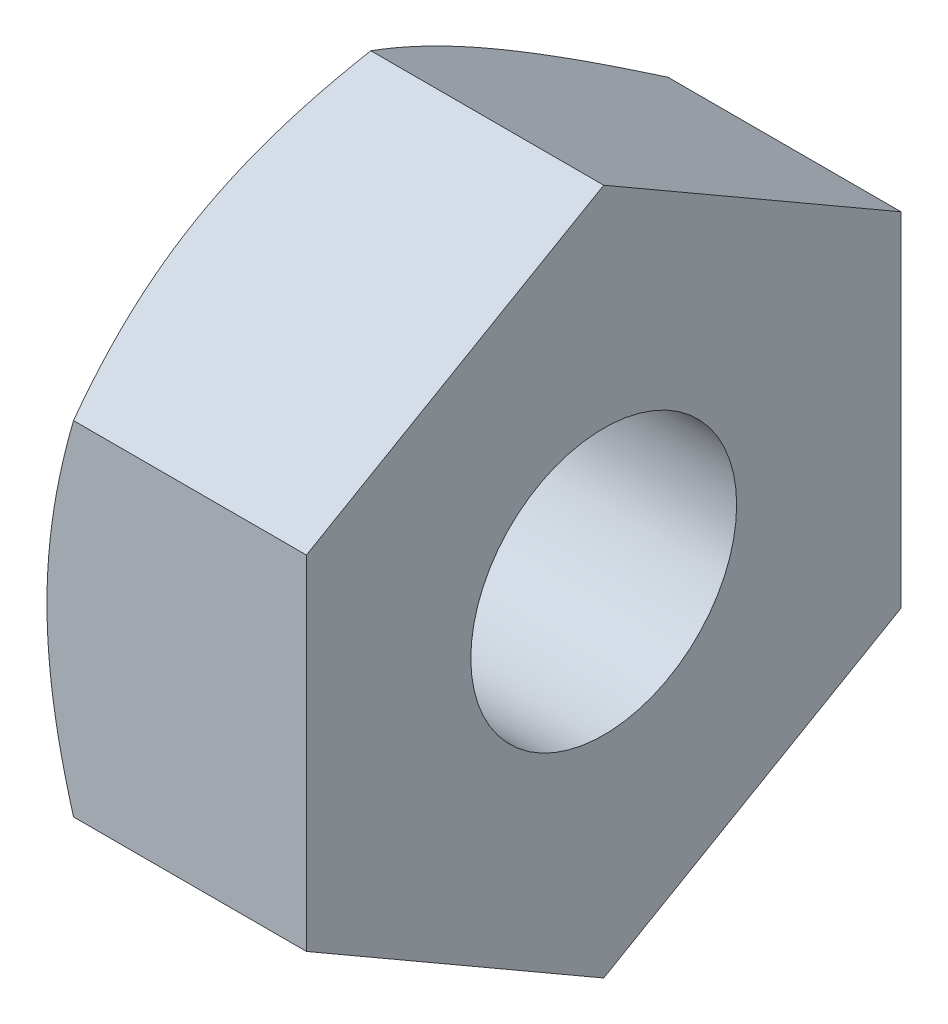
ISO-10303-21;
HEADER;
FILE_DESCRIPTION(('STEP AP214'),'2;1');
FILE_NAME('part.step','',(''),(''),'','','');
FILE_SCHEMA(('AUTOMOTIVE_DESIGN { 1 0 10303 214 1 1 1 1 }'));
ENDSEC;
DATA;
#1=APPLICATION_CONTEXT('core data for automotive mechanical design processes');
#2=APPLICATION_PROTOCOL_DEFINITION('international standard','automotive_design',2000,#1);
#3=PRODUCT_CONTEXT('',#1,'mechanical');
#4=PRODUCT('Part','Part','',(#3));
#5=PRODUCT_RELATED_PRODUCT_CATEGORY('part','',(#4));
#6=PRODUCT_DEFINITION_FORMATION('','',#4);
#7=PRODUCT_DEFINITION_CONTEXT('part definition',#1,'design');
#8=PRODUCT_DEFINITION('design','',#6,#7);
#9=PRODUCT_DEFINITION_SHAPE('','',#8);
#10=(LENGTH_UNIT() NAMED_UNIT(*) SI_UNIT(.MILLI.,.METRE.));
#11=(NAMED_UNIT(*) PLANE_ANGLE_UNIT() SI_UNIT($,.RADIAN.));
#12=(NAMED_UNIT(*) SI_UNIT($,.STERADIAN.) SOLID_ANGLE_UNIT());
#13=UNCERTAINTY_MEASURE_WITH_UNIT(LENGTH_MEASURE(1.E-05),#10,'distance_accuracy_value','');
#14=(GEOMETRIC_REPRESENTATION_CONTEXT(3) GLOBAL_UNCERTAINTY_ASSIGNED_CONTEXT((#13)) GLOBAL_UNIT_ASSIGNED_CONTEXT((#10,
#11,#12)) REPRESENTATION_CONTEXT('',''));
#15=CARTESIAN_POINT('',(0.,0.,0.));
#16=DIRECTION('',(0.,0.,1.));
#17=DIRECTION('',(1.,0.,0.));
#18=AXIS2_PLACEMENT_3D('',#15,#16,#17);
#19=CARTESIAN_POINT('',(-2.4,1.58771324027147,-2.75));
#20=DIRECTION('',(0.,0.866025403784439,-0.5));
#21=DIRECTION('',(0.,0.5,0.866025403784439));
#22=AXIS2_PLACEMENT_3D('',#19,#20,#21);
#23=PLANE('',#22);
#24=DIRECTION('',(1.,0.,0.));
#25=VECTOR('',#24,1.);
#26=CARTESIAN_POINT('',(-2.4,1.58771324027147,-2.75));
#27=LINE('',#26,#25);
#28=CARTESIAN_POINT('',(-2.15437990693814,1.58771324027146,-2.75));
#29=VERTEX_POINT('',#28);
#30=CARTESIAN_POINT('',(0.,1.58771324027147,-2.75));
#31=VERTEX_POINT('',#30);
#32=EDGE_CURVE('E139',#29,#31,#27,.T.);
#33=ORIENTED_EDGE('',*,*,#32,.F.);
#34=CARTESIAN_POINT('',(-2.15431323663524,1.58759777021763,-2.7502));
#35=CARTESIAN_POINT('',(-2.19461233775074,1.65737010029698,-2.62935077934009));
#36=CARTESIAN_POINT('',(-2.23126309740234,1.72774469983533,-2.50745839737737));
#37=CARTESIAN_POINT('',(-2.2952378170302,1.86971254687002,-2.26156287327211));
#38=CARTESIAN_POINT('',(-2.32253914432551,1.94130831721582,-2.13755536142615));
#39=CARTESIAN_POINT('',(-2.36503825470589,2.08361254889598,-1.89107720202406));
#40=CARTESIAN_POINT('',(-2.38051888137754,2.15429911309863,-1.76864448141258));
#41=CARTESIAN_POINT('',(-2.39900060263006,2.29600490065922,-1.52320285763109));
#42=CARTESIAN_POINT('',(-2.4020170005374,2.36702360884403,-1.40019484676709));
#43=CARTESIAN_POINT('',(-2.39574685457146,2.49972966594896,-1.17034121338921));
#44=CARTESIAN_POINT('',(-2.3879998457233,2.56143686540072,-1.06346120874598));
#45=CARTESIAN_POINT('',(-2.36344481893565,2.68444923614046,-0.850397532665252));
#46=CARTESIAN_POINT('',(-2.34662841034943,2.74575398185007,-0.744214598351112));
#47=CARTESIAN_POINT('',(-2.30458807765405,2.86902004703206,-0.530711510606818));
#48=CARTESIAN_POINT('',(-2.27918591931277,2.93096576264318,-0.423418383857146));
#49=CARTESIAN_POINT('',(-2.22153277416002,3.05393320806133,-0.21043252071595));
#50=CARTESIAN_POINT('',(-2.18929533670102,3.11495651365995,-0.104737054973348));
#51=CARTESIAN_POINT('',(-2.15431323663525,3.17554195059677,0.000199999999999626));
#52=B_SPLINE_CURVE_WITH_KNOTS('',3,(#34,#35,#36,#37,#38,#39,#40,#41,#42,#43,#44,#45,#46,#47,#48,
#49,#50,#51),.UNSPECIFIED.,.F.,.F.,(4,2,2,2,2,2,2,2,4),(0.,0.435912828725887,0.87287355711633,
1.29901931904671,1.72464171213573,2.09526089052937,2.46622354066374,2.84541551798557,
3.22386274754524),.UNSPECIFIED.);
#53=CARTESIAN_POINT('',(-2.4,2.38156986040721,-1.375));
#54=VERTEX_POINT('',#53);
#55=EDGE_CURVE('E120',#29,#54,#52,.T.);
#56=ORIENTED_EDGE('',*,*,#55,.T.);
#57=CARTESIAN_POINT('',(-2.15437990693814,3.17542648054294,0.));
#58=VERTEX_POINT('',#57);
#59=EDGE_CURVE('E52',#54,#58,#52,.T.);
#60=ORIENTED_EDGE('',*,*,#59,.T.);
#61=DIRECTION('',(1.,0.,0.));
#62=VECTOR('',#61,1.);
#63=CARTESIAN_POINT('',(-2.4,3.17542648054294,0.));
#64=LINE('',#63,#62);
#65=CARTESIAN_POINT('',(0.,3.17542648054294,0.));
#66=VERTEX_POINT('',#65);
#67=EDGE_CURVE('E118',#58,#66,#64,.T.);
#68=ORIENTED_EDGE('',*,*,#67,.T.);
#69=DIRECTION('',(0.,0.5,0.866025403784439));
#70=VECTOR('',#69,1.);
#71=CARTESIAN_POINT('',(0.,1.58771324027147,-2.75));
#72=LINE('',#71,#70);
#73=EDGE_CURVE('E150',#31,#66,#72,.T.);
#74=ORIENTED_EDGE('',*,*,#73,.F.);
#75=EDGE_LOOP('',(#33,#56,#60,#68,#74));
#76=FACE_BOUND('',#75,.T.);
#77=ADVANCED_FACE('F36',(#76),#23,.T.);
#78=CARTESIAN_POINT('',(-2.4,-1.58771324027148,-2.75));
#79=DIRECTION('',(0.,0.,-1.));
#80=DIRECTION('',(-1.,0.,0.));
#81=AXIS2_PLACEMENT_3D('',#78,#79,#80);
#82=PLANE('',#81);
#83=DIRECTION('',(1.,0.,0.));
#84=VECTOR('',#83,1.);
#85=CARTESIAN_POINT('',(-2.4,-1.58771324027148,-2.75));
#86=LINE('',#85,#84);
#87=CARTESIAN_POINT('',(-2.15437990693814,-1.58771324027149,-2.74999999999998));
#88=VERTEX_POINT('',#87);
#89=CARTESIAN_POINT('',(0.,-1.58771324027148,-2.75));
#90=VERTEX_POINT('',#89);
#91=EDGE_CURVE('E137',#88,#90,#86,.T.);
#92=ORIENTED_EDGE('',*,*,#91,.F.);
#93=CARTESIAN_POINT('',(-1.08405156039708,-4.21084949309676,-2.75));
#94=CARTESIAN_POINT('',(-1.14240006384777,-4.0901089421409,-2.75));
#95=CARTESIAN_POINT('',(-1.20016853488243,-3.9690829206551,-2.75));
#96=CARTESIAN_POINT('',(-1.31421396157696,-3.72630558284844,-2.75));
#97=CARTESIAN_POINT('',(-1.37049065899754,-3.60455414536201,-2.75));
#98=CARTESIAN_POINT('',(-1.48151755664725,-3.35951393034355,-2.75));
#99=CARTESIAN_POINT('',(-1.53625717839417,-3.23622034236437,-2.75));
#100=CARTESIAN_POINT('',(-1.64338522252356,-2.98861980138744,-2.75));
#101=CARTESIAN_POINT('',(-1.69577376746325,-2.86431290161182,-2.75));
#102=CARTESIAN_POINT('',(-1.79819642785388,-2.61294485887172,-2.75));
#103=CARTESIAN_POINT('',(-1.84819374210161,-2.48586863815655,-2.75));
#104=CARTESIAN_POINT('',(-1.9442725912154,-2.23021732171541,-2.75));
#105=CARTESIAN_POINT('',(-1.99035369042303,-2.10164206103364,-2.75));
#106=CARTESIAN_POINT('',(-2.07736192295377,-1.84305218799468,-2.75));
#107=CARTESIAN_POINT('',(-2.11830001358611,-1.71304130052584,-2.75));
#108=CARTESIAN_POINT('',(-2.19369269237565,-1.45117125062148,-2.75));
#109=CARTESIAN_POINT('',(-2.22814933084723,-1.31931268690203,-2.75));
#110=CARTESIAN_POINT('',(-2.2889063284691,-1.05365722480013,-2.75));
#111=CARTESIAN_POINT('',(-2.31520451590488,-0.919859820217597,-2.75));
#112=CARTESIAN_POINT('',(-2.35787396280339,-0.650651874037387,-2.75));
#113=CARTESIAN_POINT('',(-2.37424521348946,-0.515241331013601,-2.75));
#114=CARTESIAN_POINT('',(-2.39561250345976,-0.244373242869217,-2.75));
#115=CARTESIAN_POINT('',(-2.40068055677322,-0.108921526377139,-2.75));
#116=CARTESIAN_POINT('',(-2.39917220436733,0.161887058855127,-2.75));
#117=CARTESIAN_POINT('',(-2.39259882131445,0.297243943089634,-2.75));
#118=CARTESIAN_POINT('',(-2.37189586995316,0.528385436717537,-2.75));
#119=CARTESIAN_POINT('',(-2.36046235896981,0.624425050137497,-2.75));
#120=CARTESIAN_POINT('',(-2.33247828038665,0.815762399811543,-2.75));
#121=CARTESIAN_POINT('',(-2.31592690577232,0.911060016631967,-2.75));
#122=CARTESIAN_POINT('',(-2.25946463872172,1.19576218748917,-2.75));
#123=CARTESIAN_POINT('',(-2.21276014058271,1.38383224738498,-2.75));
#124=CARTESIAN_POINT('',(-2.13220750296942,1.66525048947487,-2.75));
#125=CARTESIAN_POINT('',(-2.1031966650045,1.76006556248559,-2.75));
#126=CARTESIAN_POINT('',(-2.04230435109341,1.94870609382217,-2.75));
#127=CARTESIAN_POINT('',(-2.0104248551215,2.04253218553698,-2.75));
#128=CARTESIAN_POINT('',(-1.94445858181355,2.22880240354987,-2.75));
#129=CARTESIAN_POINT('',(-1.91038523854447,2.32125133588454,-2.75));
#130=CARTESIAN_POINT('',(-1.84023863176889,2.50543192042631,-2.75));
#131=CARTESIAN_POINT('',(-1.80416455996268,2.59716326539582,-2.75));
#132=CARTESIAN_POINT('',(-1.76728755800251,2.68856293053349,-2.75));
#133=B_SPLINE_CURVE_WITH_KNOTS('',3,(#93,#94,#95,#96,#97,#98,#99,#100,#101,#102,#103,#104,#105,
#106,#107,#108,#109,#110,#111,#112,#113,#114,#115,#116,#117,#118,#119,#120,#121,#122,#123,#124,
#125,#126,#127,#128,#129,#130,#131,#132),.UNSPECIFIED.,.F.,.F.,(4,2,2,2,2,2,2,2,2,2,2,2,2,2,2,2,
2,2,2,4),(0.,0.402305607365936,0.804680408536997,1.20935783819118,1.61401414820818,
2.0236383818577,2.43330812457348,2.842089694796,3.25074173456636,3.65950246109143,
4.06826354901183,4.47441284024649,4.88045669141171,5.17046846817546,5.46052599902452,
6.04107275309884,6.33851131304663,6.63574613017457,6.93130791005795,7.22698998004825),.UNSPECIFIED.);
#134=CARTESIAN_POINT('',(-2.4,0.,-2.75));
#135=VERTEX_POINT('',#134);
#136=EDGE_CURVE('E241',#88,#135,#133,.T.);
#137=ORIENTED_EDGE('',*,*,#136,.T.);
#138=EDGE_CURVE('E163',#135,#29,#133,.T.);
#139=ORIENTED_EDGE('',*,*,#138,.T.);
#140=ORIENTED_EDGE('',*,*,#32,.T.);
#141=DIRECTION('',(0.,1.,0.));
#142=VECTOR('',#141,1.);
#143=CARTESIAN_POINT('',(0.,-1.58771324027148,-2.75));
#144=LINE('',#143,#142);
#145=EDGE_CURVE('E127',#90,#31,#144,.T.);
#146=ORIENTED_EDGE('',*,*,#145,.F.);
#147=EDGE_LOOP('',(#92,#137,#139,#140,#146));
#148=FACE_BOUND('',#147,.T.);
#149=ADVANCED_FACE('F227',(#148),#82,.T.);
#150=CARTESIAN_POINT('',(-2.4,-3.17542648054295,0.));
#151=DIRECTION('',(0.,-0.866025403784439,-0.5));
#152=DIRECTION('',(0.,0.5,-0.866025403784439));
#153=AXIS2_PLACEMENT_3D('',#150,#151,#152);
#154=PLANE('',#153);
#155=DIRECTION('',(1.,0.,0.));
#156=VECTOR('',#155,1.);
#157=CARTESIAN_POINT('',(-2.4,-3.17542648054295,0.));
#158=LINE('',#157,#156);
#159=CARTESIAN_POINT('',(-2.15437990693814,-3.17542648054294,0.));
#160=VERTEX_POINT('',#159);
#161=CARTESIAN_POINT('',(0.,-3.17542648054295,0.));
#162=VERTEX_POINT('',#161);
#163=EDGE_CURVE('E135',#160,#162,#158,.T.);
#164=ORIENTED_EDGE('',*,*,#163,.F.);
#165=CARTESIAN_POINT('',(-2.15431323663524,-3.17554195059679,0.000199999999999914));
#166=CARTESIAN_POINT('',(-2.19461233775074,-3.10576962051743,-0.120649220659906));
#167=CARTESIAN_POINT('',(-2.23126309740234,-3.03539502097909,-0.242541602622635));
#168=CARTESIAN_POINT('',(-2.2952378170302,-2.89342717394439,-0.488437126727894));
#169=CARTESIAN_POINT('',(-2.3225391443255,-2.82183140359859,-0.612444638573857));
#170=CARTESIAN_POINT('',(-2.36503825470588,-2.67952717191843,-0.858922797975945));
#171=CARTESIAN_POINT('',(-2.38051888137754,-2.60884060771578,-0.981355518587419));
#172=CARTESIAN_POINT('',(-2.39900060263006,-2.46713482015519,-1.22679714236892));
#173=CARTESIAN_POINT('',(-2.4020170005374,-2.39611611197038,-1.34980515323291));
#174=CARTESIAN_POINT('',(-2.39574685457145,-2.26341005486545,-1.5796587866108));
#175=CARTESIAN_POINT('',(-2.38799984572329,-2.20170285541369,-1.68653879125402));
#176=CARTESIAN_POINT('',(-2.36344481893564,-2.07869048467395,-1.89960246733475));
#177=CARTESIAN_POINT('',(-2.34662841034943,-2.01738573896434,-2.00578540164889));
#178=CARTESIAN_POINT('',(-2.30458807765404,-1.89411967378236,-2.21928848939318));
#179=CARTESIAN_POINT('',(-2.27918591931277,-1.83217395817124,-2.32658161614286));
#180=CARTESIAN_POINT('',(-2.22153277416002,-1.70920651275308,-2.53956747928405));
#181=CARTESIAN_POINT('',(-2.18929533670102,-1.64818320715447,-2.64526294502665));
#182=CARTESIAN_POINT('',(-2.15431323663524,-1.58759777021764,-2.7502));
#183=B_SPLINE_CURVE_WITH_KNOTS('',3,(#165,#166,#167,#168,#169,#170,#171,#172,#173,#174,#175,
#176,#177,#178,#179,#180,#181,#182),.UNSPECIFIED.,.F.,.F.,(4,2,2,2,2,2,2,2,4),(0.,
0.435912828725889,0.872873557116333,1.29901931904672,1.72464171213574,2.09526089052938,
2.46622354066374,2.84541551798557,3.22386274754524),.UNSPECIFIED.);
#184=CARTESIAN_POINT('',(-2.4,-2.38156986040721,-1.375));
#185=VERTEX_POINT('',#184);
#186=EDGE_CURVE('E152',#160,#185,#183,.T.);
#187=ORIENTED_EDGE('',*,*,#186,.T.);
#188=EDGE_CURVE('E153',#185,#88,#183,.T.);
#189=ORIENTED_EDGE('',*,*,#188,.T.);
#190=ORIENTED_EDGE('',*,*,#91,.T.);
#191=DIRECTION('',(0.,0.5,-0.866025403784439));
#192=VECTOR('',#191,1.);
#193=CARTESIAN_POINT('',(0.,-3.17542648054295,0.));
#194=LINE('',#193,#192);
#195=EDGE_CURVE('E131',#162,#90,#194,.T.);
#196=ORIENTED_EDGE('',*,*,#195,.F.);
#197=EDGE_LOOP('',(#164,#187,#189,#190,#196));
#198=FACE_BOUND('',#197,.T.);
#199=ADVANCED_FACE('F170',(#198),#154,.T.);
#200=CARTESIAN_POINT('',(-2.4,-1.58771324027148,2.75));
#201=DIRECTION('',(0.,-0.866025403784439,0.5));
#202=DIRECTION('',(0.,-0.5,-0.866025403784439));
#203=AXIS2_PLACEMENT_3D('',#200,#201,#202);
#204=PLANE('',#203);
#205=DIRECTION('',(1.,0.,0.));
#206=VECTOR('',#205,1.);
#207=CARTESIAN_POINT('',(-2.4,-1.58771324027148,2.75));
#208=LINE('',#207,#206);
#209=CARTESIAN_POINT('',(-2.15437990693814,-1.58771324027146,2.75));
#210=VERTEX_POINT('',#209);
#211=CARTESIAN_POINT('',(0.,-1.58771324027148,2.75));
#212=VERTEX_POINT('',#211);
#213=EDGE_CURVE('E128',#210,#212,#208,.T.);
#214=ORIENTED_EDGE('',*,*,#213,.F.);
#215=CARTESIAN_POINT('',(-2.15431323663524,-1.58759777021764,2.7502));
#216=CARTESIAN_POINT('',(-2.19461233775074,-1.65737010029699,2.62935077934009));
#217=CARTESIAN_POINT('',(-2.23126309740234,-1.72774469983534,2.50745839737737));
#218=CARTESIAN_POINT('',(-2.2952378170302,-1.86971254687003,2.26156287327211));
#219=CARTESIAN_POINT('',(-2.3225391443255,-1.94130831721584,2.13755536142614));
#220=CARTESIAN_POINT('',(-2.36503825470588,-2.083612548896,1.89107720202406));
#221=CARTESIAN_POINT('',(-2.38051888137754,-2.15429911309865,1.76864448141258));
#222=CARTESIAN_POINT('',(-2.39900060263006,-2.29600490065924,1.52320285763108));
#223=CARTESIAN_POINT('',(-2.4020170005374,-2.36702360884404,1.40019484676709));
#224=CARTESIAN_POINT('',(-2.39574685457145,-2.49972966594898,1.17034121338921));
#225=CARTESIAN_POINT('',(-2.38799984572329,-2.56143686540073,1.06346120874598));
#226=CARTESIAN_POINT('',(-2.36344481893564,-2.68444923614047,0.85039753266525));
#227=CARTESIAN_POINT('',(-2.34662841034943,-2.74575398185009,0.744214598351111));
#228=CARTESIAN_POINT('',(-2.30458807765404,-2.86902004703207,0.530711510606816));
#229=CARTESIAN_POINT('',(-2.27918591931277,-2.93096576264319,0.423418383857145));
#230=CARTESIAN_POINT('',(-2.22153277416002,-3.05393320806134,0.210432520715949));
#231=CARTESIAN_POINT('',(-2.18929533670102,-3.11495651365996,0.104737054973347));
#232=CARTESIAN_POINT('',(-2.15431323663524,-3.17554195059679,-0.000199999999999977));
#233=B_SPLINE_CURVE_WITH_KNOTS('',3,(#215,#216,#217,#218,#219,#220,#221,#222,#223,#224,#225,
#226,#227,#228,#229,#230,#231,#232),.UNSPECIFIED.,.F.,.F.,(4,2,2,2,2,2,2,2,4),(0.,
0.435912828725889,0.872873557116332,1.29901931904672,1.72464171213574,2.09526089052937,
2.46622354066374,2.84541551798557,3.22386274754524),.UNSPECIFIED.);
#234=CARTESIAN_POINT('',(-2.4,-2.38156986040721,1.375));
#235=VERTEX_POINT('',#234);
#236=EDGE_CURVE('E203',#210,#235,#233,.T.);
#237=ORIENTED_EDGE('',*,*,#236,.T.);
#238=EDGE_CURVE('E162',#235,#160,#233,.T.);
#239=ORIENTED_EDGE('',*,*,#238,.T.);
#240=ORIENTED_EDGE('',*,*,#163,.T.);
#241=DIRECTION('',(0.,-0.5,-0.866025403784438));
#242=VECTOR('',#241,1.);
#243=CARTESIAN_POINT('',(0.,-1.58771324027148,2.75));
#244=LINE('',#243,#242);
#245=EDGE_CURVE('E143',#212,#162,#244,.T.);
#246=ORIENTED_EDGE('',*,*,#245,.F.);
#247=EDGE_LOOP('',(#214,#237,#239,#240,#246));
#248=FACE_BOUND('',#247,.T.);
#249=ADVANCED_FACE('F210',(#248),#204,.T.);
#250=CARTESIAN_POINT('',(-2.4,1.58771324027147,2.75));
#251=DIRECTION('',(0.,0.,1.));
#252=DIRECTION('',(1.,0.,0.));
#253=AXIS2_PLACEMENT_3D('',#250,#251,#252);
#254=PLANE('',#253);
#255=DIRECTION('',(1.,0.,0.));
#256=VECTOR('',#255,1.);
#257=CARTESIAN_POINT('',(-2.4,1.58771324027147,2.75));
#258=LINE('',#257,#256);
#259=CARTESIAN_POINT('',(-2.15437990693814,1.58771324027147,2.75));
#260=VERTEX_POINT('',#259);
#261=CARTESIAN_POINT('',(0.,1.58771324027147,2.75));
#262=VERTEX_POINT('',#261);
#263=EDGE_CURVE('E126',#260,#262,#258,.T.);
#264=ORIENTED_EDGE('',*,*,#263,.F.);
#265=CARTESIAN_POINT('',(-1.08405156039708,-4.21084949309676,2.75));
#266=CARTESIAN_POINT('',(-1.14240006384777,-4.0901089421409,2.75));
#267=CARTESIAN_POINT('',(-1.20016853488243,-3.9690829206551,2.75));
#268=CARTESIAN_POINT('',(-1.31421396157696,-3.72630558284844,2.75));
#269=CARTESIAN_POINT('',(-1.37049065899754,-3.60455414536201,2.75));
#270=CARTESIAN_POINT('',(-1.48151755664725,-3.35951393034355,2.75));
#271=CARTESIAN_POINT('',(-1.53625717839417,-3.23622034236437,2.75));
#272=CARTESIAN_POINT('',(-1.64338522252356,-2.98861980138744,2.75));
#273=CARTESIAN_POINT('',(-1.69577376746325,-2.86431290161182,2.75));
#274=CARTESIAN_POINT('',(-1.79819642785388,-2.61294485887172,2.75));
#275=CARTESIAN_POINT('',(-1.84819374210161,-2.48586863815655,2.75));
#276=CARTESIAN_POINT('',(-1.9442725912154,-2.23021732171541,2.75));
#277=CARTESIAN_POINT('',(-1.99035369042303,-2.10164206103364,2.75));
#278=CARTESIAN_POINT('',(-2.07736192295377,-1.84305218799468,2.75));
#279=CARTESIAN_POINT('',(-2.11830001358611,-1.71304130052584,2.75));
#280=CARTESIAN_POINT('',(-2.19369269237565,-1.45117125062148,2.75));
#281=CARTESIAN_POINT('',(-2.22814933084723,-1.31931268690203,2.75));
#282=CARTESIAN_POINT('',(-2.2889063284691,-1.05365722480013,2.75));
#283=CARTESIAN_POINT('',(-2.31520451590488,-0.919859820217596,2.75));
#284=CARTESIAN_POINT('',(-2.35787396280339,-0.650651874037386,2.75));
#285=CARTESIAN_POINT('',(-2.37424521348946,-0.5152413310136,2.75));
#286=CARTESIAN_POINT('',(-2.39561250345976,-0.244373242869216,2.75));
#287=CARTESIAN_POINT('',(-2.40068055677322,-0.108921526377138,2.75));
#288=CARTESIAN_POINT('',(-2.39917220436733,0.161887058855129,2.75));
#289=CARTESIAN_POINT('',(-2.39259882131445,0.297243943089635,2.75));
#290=CARTESIAN_POINT('',(-2.37189586995316,0.528385436717538,2.75));
#291=CARTESIAN_POINT('',(-2.36046235896981,0.624425050137498,2.75));
#292=CARTESIAN_POINT('',(-2.33247828038665,0.815762399811544,2.75));
#293=CARTESIAN_POINT('',(-2.31592690577232,0.911060016631968,2.75));
#294=CARTESIAN_POINT('',(-2.25946463872172,1.19576218748917,2.75));
#295=CARTESIAN_POINT('',(-2.21276014058271,1.38383224738498,2.75));
#296=CARTESIAN_POINT('',(-2.13220750296942,1.66525048947487,2.75));
#297=CARTESIAN_POINT('',(-2.1031966650045,1.7600655624856,2.75));
#298=CARTESIAN_POINT('',(-2.04230435109341,1.94870609382217,2.75));
#299=CARTESIAN_POINT('',(-2.01042485512149,2.04253218553698,2.75));
#300=CARTESIAN_POINT('',(-1.94445858181355,2.22880240354987,2.75));
#301=CARTESIAN_POINT('',(-1.91038523854446,2.32125133588454,2.75));
#302=CARTESIAN_POINT('',(-1.84023863176889,2.50543192042631,2.75));
#303=CARTESIAN_POINT('',(-1.80416455996268,2.59716326539582,2.75));
#304=CARTESIAN_POINT('',(-1.76728755800251,2.68856293053349,2.75));
#305=B_SPLINE_CURVE_WITH_KNOTS('',3,(#265,#266,#267,#268,#269,#270,#271,#272,#273,#274,#275,
#276,#277,#278,#279,#280,#281,#282,#283,#284,#285,#286,#287,#288,#289,#290,#291,#292,#293,#294,
#295,#296,#297,#298,#299,#300,#301,#302,#303,#304),.UNSPECIFIED.,.F.,.F.,(4,2,2,2,2,2,2,2,2,2,2,
2,2,2,2,2,2,2,2,4),(0.,0.402305607365936,0.804680408536996,1.20935783819118,1.61401414820818,
2.0236383818577,2.43330812457348,2.842089694796,3.25074173456636,3.65950246109143,
4.06826354901183,4.47441284024649,4.88045669141171,5.17046846817546,5.46052599902452,
6.04107275309884,6.33851131304663,6.63574613017457,6.93130791005795,7.22698998004826),.UNSPECIFIED.);
#306=CARTESIAN_POINT('',(-2.4,0.,2.75));
#307=VERTEX_POINT('',#306);
#308=EDGE_CURVE('E112',#260,#307,#305,.F.);
#309=ORIENTED_EDGE('',*,*,#308,.T.);
#310=EDGE_CURVE('E209',#307,#210,#305,.F.);
#311=ORIENTED_EDGE('',*,*,#310,.T.);
#312=ORIENTED_EDGE('',*,*,#213,.T.);
#313=DIRECTION('',(0.,-1.,0.));
#314=VECTOR('',#313,1.);
#315=CARTESIAN_POINT('',(0.,1.58771324027147,2.75));
#316=LINE('',#315,#314);
#317=EDGE_CURVE('E146',#262,#212,#316,.T.);
#318=ORIENTED_EDGE('',*,*,#317,.F.);
#319=EDGE_LOOP('',(#264,#309,#311,#312,#318));
#320=FACE_BOUND('',#319,.T.);
#321=ADVANCED_FACE('F213',(#320),#254,.T.);
#322=CARTESIAN_POINT('',(-2.4,3.17542648054294,0.));
#323=DIRECTION('',(0.,0.866025403784439,0.5));
#324=DIRECTION('',(0.,-0.5,0.866025403784439));
#325=AXIS2_PLACEMENT_3D('',#322,#323,#324);
#326=PLANE('',#325);
#327=ORIENTED_EDGE('',*,*,#67,.F.);
#328=CARTESIAN_POINT('',(-2.15431323663525,3.17554195059677,-0.000200000000000679));
#329=CARTESIAN_POINT('',(-2.19461233775074,3.10576962051742,0.120649220659905));
#330=CARTESIAN_POINT('',(-2.23126309740234,3.03539502097907,0.242541602622633));
#331=CARTESIAN_POINT('',(-2.2952378170302,2.89342717394438,0.488437126727891));
#332=CARTESIAN_POINT('',(-2.32253914432551,2.82183140359858,0.612444638573853));
#333=CARTESIAN_POINT('',(-2.36503825470589,2.67952717191842,0.858922797975941));
#334=CARTESIAN_POINT('',(-2.38051888137755,2.60884060771577,0.981355518587414));
#335=CARTESIAN_POINT('',(-2.39900060263006,2.46713482015518,1.22679714236891));
#336=CARTESIAN_POINT('',(-2.4020170005374,2.39611611197037,1.34980515323291));
#337=CARTESIAN_POINT('',(-2.39574685457146,2.26341005486544,1.57965878661079));
#338=CARTESIAN_POINT('',(-2.3879998457233,2.20170285541368,1.68653879125402));
#339=CARTESIAN_POINT('',(-2.36344481893565,2.07869048467394,1.89960246733475));
#340=CARTESIAN_POINT('',(-2.34662841034943,2.01738573896433,2.00578540164889));
#341=CARTESIAN_POINT('',(-2.30458807765405,1.89411967378234,2.21928848939318));
#342=CARTESIAN_POINT('',(-2.27918591931277,1.83217395817122,2.32658161614285));
#343=CARTESIAN_POINT('',(-2.22153277416002,1.70920651275307,2.53956747928405));
#344=CARTESIAN_POINT('',(-2.18929533670102,1.64818320715446,2.64526294502665));
#345=CARTESIAN_POINT('',(-2.15431323663524,1.58759777021763,2.7502));
#346=B_SPLINE_CURVE_WITH_KNOTS('',3,(#328,#329,#330,#331,#332,#333,#334,#335,#336,#337,#338,
#339,#340,#341,#342,#343,#344,#345),.UNSPECIFIED.,.F.,.F.,(4,2,2,2,2,2,2,2,4),(0.,
0.435912828725887,0.872873557116329,1.29901931904671,1.72464171213573,2.09526089052937,
2.46622354066374,2.84541551798557,3.22386274754524),.UNSPECIFIED.);
#347=CARTESIAN_POINT('',(-2.4,2.38156986040721,1.375));
#348=VERTEX_POINT('',#347);
#349=EDGE_CURVE('E106',#58,#348,#346,.T.);
#350=ORIENTED_EDGE('',*,*,#349,.T.);
#351=EDGE_CURVE('E59',#348,#260,#346,.T.);
#352=ORIENTED_EDGE('',*,*,#351,.T.);
#353=ORIENTED_EDGE('',*,*,#263,.T.);
#354=DIRECTION('',(0.,-0.5,0.866025403784439));
#355=VECTOR('',#354,1.);
#356=CARTESIAN_POINT('',(0.,3.17542648054294,0.));
#357=LINE('',#356,#355);
#358=EDGE_CURVE('E124',#66,#262,#357,.T.);
#359=ORIENTED_EDGE('',*,*,#358,.F.);
#360=EDGE_LOOP('',(#327,#350,#352,#353,#359));
#361=FACE_BOUND('',#360,.T.);
#362=ADVANCED_FACE('F122',(#361),#326,.T.);
#363=CARTESIAN_POINT('',(0.,0.,0.));
#364=DIRECTION('',(1.,0.,0.));
#365=DIRECTION('',(0.,0.,-1.));
#366=AXIS2_PLACEMENT_3D('',#363,#364,#365);
#367=PLANE('',#366);
#368=CARTESIAN_POINT('',(0.,0.,0.));
#369=DIRECTION('',(-1.,0.,0.));
#370=DIRECTION('',(0.,0.,1.));
#371=AXIS2_PLACEMENT_3D('',#368,#369,#370);
#372=CIRCLE('',#371,1.2295);
#373=CARTESIAN_POINT('',(0.,0.,1.2295));
#374=VERTEX_POINT('',#373);
#375=EDGE_CURVE('E268',#374,#374,#372,.T.);
#376=ORIENTED_EDGE('',*,*,#375,.T.);
#377=EDGE_LOOP('',(#376));
#378=FACE_BOUND('',#377,.T.);
#379=ORIENTED_EDGE('',*,*,#73,.T.);
#380=ORIENTED_EDGE('',*,*,#358,.T.);
#381=ORIENTED_EDGE('',*,*,#317,.T.);
#382=ORIENTED_EDGE('',*,*,#245,.T.);
#383=ORIENTED_EDGE('',*,*,#195,.T.);
#384=ORIENTED_EDGE('',*,*,#145,.T.);
#385=EDGE_LOOP('',(#379,#380,#381,#382,#383,#384));
#386=FACE_BOUND('',#385,.T.);
#387=ADVANCED_FACE('F220',(#378,#386),#367,.T.);
#388=CARTESIAN_POINT('',(-2.4,0.,0.));
#389=DIRECTION('',(1.,0.,0.));
#390=DIRECTION('',(0.,0.,-1.));
#391=AXIS2_PLACEMENT_3D('',#388,#389,#390);
#392=CONICAL_SURFACE('',#391,2.75,1.0471975511966);
#393=CARTESIAN_POINT('',(-2.4,0.,0.));
#394=DIRECTION('',(1.,0.,0.));
#395=DIRECTION('',(0.,0.,-1.));
#396=AXIS2_PLACEMENT_3D('',#393,#394,#395);
#397=CIRCLE('',#396,2.75);
#398=EDGE_CURVE('E40',#185,#135,#397,.T.);
#399=ORIENTED_EDGE('',*,*,#398,.T.);
#400=ORIENTED_EDGE('',*,*,#136,.F.);
#401=ORIENTED_EDGE('',*,*,#188,.F.);
#402=EDGE_LOOP('',(#399,#400,#401));
#403=FACE_BOUND('',#402,.T.);
#404=ADVANCED_FACE('F224',(#403),#392,.T.);
#405=ORIENTED_EDGE('',*,*,#238,.F.);
#406=EDGE_CURVE('E254',#235,#185,#397,.T.);
#407=ORIENTED_EDGE('',*,*,#406,.T.);
#408=ORIENTED_EDGE('',*,*,#186,.F.);
#409=EDGE_LOOP('',(#405,#407,#408));
#410=FACE_BOUND('',#409,.T.);
#411=ADVANCED_FACE('F179',(#410),#392,.T.);
#412=ORIENTED_EDGE('',*,*,#310,.F.);
#413=EDGE_CURVE('E258',#307,#235,#397,.T.);
#414=ORIENTED_EDGE('',*,*,#413,.T.);
#415=ORIENTED_EDGE('',*,*,#236,.F.);
#416=EDGE_LOOP('',(#412,#414,#415));
#417=FACE_BOUND('',#416,.T.);
#418=ADVANCED_FACE('F178',(#417),#392,.T.);
#419=ORIENTED_EDGE('',*,*,#351,.F.);
#420=CARTESIAN_POINT('',(-2.4,0.,0.));
#421=DIRECTION('',(-1.,0.,0.));
#422=DIRECTION('',(0.,0.,1.));
#423=AXIS2_PLACEMENT_3D('',#420,#421,#422);
#424=CIRCLE('',#423,2.75);
#425=EDGE_CURVE('E267',#307,#348,#424,.T.);
#426=ORIENTED_EDGE('',*,*,#425,.F.);
#427=ORIENTED_EDGE('',*,*,#308,.F.);
#428=EDGE_LOOP('',(#419,#426,#427));
#429=FACE_BOUND('',#428,.T.);
#430=ADVANCED_FACE('F173',(#429),#392,.T.);
#431=EDGE_CURVE('E45',#54,#348,#397,.T.);
#432=ORIENTED_EDGE('',*,*,#431,.T.);
#433=ORIENTED_EDGE('',*,*,#349,.F.);
#434=ORIENTED_EDGE('',*,*,#59,.F.);
#435=EDGE_LOOP('',(#432,#433,#434));
#436=FACE_BOUND('',#435,.T.);
#437=ADVANCED_FACE('F107',(#436),#392,.T.);
#438=EDGE_CURVE('E11',#135,#54,#397,.T.);
#439=ORIENTED_EDGE('',*,*,#438,.T.);
#440=ORIENTED_EDGE('',*,*,#55,.F.);
#441=ORIENTED_EDGE('',*,*,#138,.F.);
#442=EDGE_LOOP('',(#439,#440,#441));
#443=FACE_BOUND('',#442,.T.);
#444=ADVANCED_FACE('F263',(#443),#392,.T.);
#445=CARTESIAN_POINT('',(-2.4,0.,0.));
#446=DIRECTION('',(1.,0.,0.));
#447=DIRECTION('',(0.,0.,-1.));
#448=AXIS2_PLACEMENT_3D('',#445,#446,#447);
#449=PLANE('',#448);
#450=CARTESIAN_POINT('',(-2.4,0.,0.));
#451=DIRECTION('',(-1.,0.,0.));
#452=DIRECTION('',(0.,0.,1.));
#453=AXIS2_PLACEMENT_3D('',#450,#451,#452);
#454=CIRCLE('',#453,1.2295);
#455=CARTESIAN_POINT('',(-2.4,0.,1.2295));
#456=VERTEX_POINT('',#455);
#457=EDGE_CURVE('E270',#456,#456,#454,.T.);
#458=ORIENTED_EDGE('',*,*,#457,.F.);
#459=EDGE_LOOP('',(#458));
#460=FACE_BOUND('',#459,.T.);
#461=ORIENTED_EDGE('',*,*,#438,.F.);
#462=ORIENTED_EDGE('',*,*,#398,.F.);
#463=ORIENTED_EDGE('',*,*,#406,.F.);
#464=ORIENTED_EDGE('',*,*,#413,.F.);
#465=ORIENTED_EDGE('',*,*,#425,.T.);
#466=ORIENTED_EDGE('',*,*,#431,.F.);
#467=EDGE_LOOP('',(#461,#462,#463,#464,#465,#466));
#468=FACE_BOUND('',#467,.T.);
#469=ADVANCED_FACE('F181',(#460,#468),#449,.F.);
#470=CARTESIAN_POINT('',(-2.4,0.,0.));
#471=DIRECTION('',(-1.,0.,0.));
#472=DIRECTION('',(0.,0.,1.));
#473=AXIS2_PLACEMENT_3D('',#470,#471,#472);
#474=CYLINDRICAL_SURFACE('',#473,1.2295);
#475=ORIENTED_EDGE('',*,*,#375,.F.);
#476=EDGE_LOOP('',(#475));
#477=FACE_BOUND('',#476,.T.);
#478=ORIENTED_EDGE('',*,*,#457,.T.);
#479=EDGE_LOOP('',(#478));
#480=FACE_BOUND('',#479,.T.);
#481=ADVANCED_FACE('F180',(#477,#480),#474,.F.);
#482=CLOSED_SHELL('',(#77,#149,#199,#249,#321,#362,#387,#404,#411,#418,#430,#437,#444,#469,#481));
#483=MANIFOLD_SOLID_BREP('B2',#482);
#484=ADVANCED_BREP_SHAPE_REPRESENTATION('',(#18,#483),#14);
#485=SHAPE_DEFINITION_REPRESENTATION(#9,#484);
ENDSEC;
END-ISO-10303-21;
